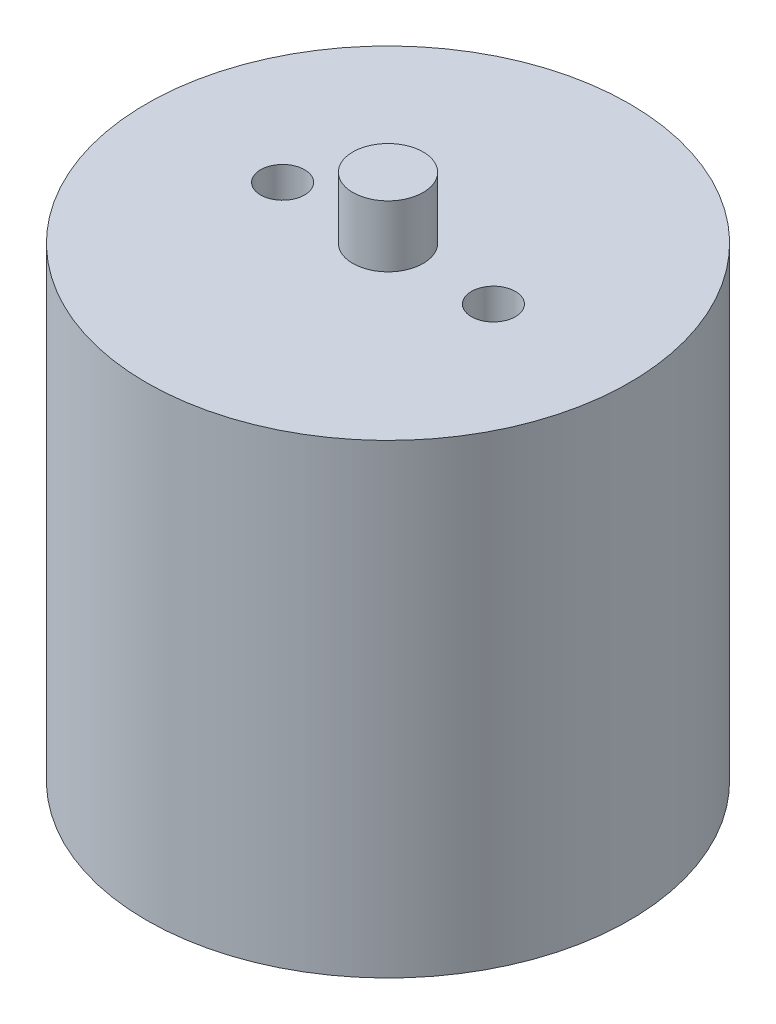
ISO-10303-21;
HEADER;
FILE_DESCRIPTION(('STEP AP214'),'2;1');
FILE_NAME('part.step','',(''),(''),'','','');
FILE_SCHEMA(('AUTOMOTIVE_DESIGN { 1 0 10303 214 1 1 1 1 }'));
ENDSEC;
DATA;
#1=APPLICATION_CONTEXT('core data for automotive mechanical design processes');
#2=APPLICATION_PROTOCOL_DEFINITION('international standard','automotive_design',2000,#1);
#3=PRODUCT_CONTEXT('',#1,'mechanical');
#4=PRODUCT('Part','Part','',(#3));
#5=PRODUCT_RELATED_PRODUCT_CATEGORY('part','',(#4));
#6=PRODUCT_DEFINITION_FORMATION('','',#4);
#7=PRODUCT_DEFINITION_CONTEXT('part definition',#1,'design');
#8=PRODUCT_DEFINITION('design','',#6,#7);
#9=PRODUCT_DEFINITION_SHAPE('','',#8);
#10=(LENGTH_UNIT() NAMED_UNIT(*) SI_UNIT(.MILLI.,.METRE.));
#11=(NAMED_UNIT(*) PLANE_ANGLE_UNIT() SI_UNIT($,.RADIAN.));
#12=(NAMED_UNIT(*) SI_UNIT($,.STERADIAN.) SOLID_ANGLE_UNIT());
#13=UNCERTAINTY_MEASURE_WITH_UNIT(LENGTH_MEASURE(1.E-05),#10,'distance_accuracy_value','');
#14=(GEOMETRIC_REPRESENTATION_CONTEXT(3) GLOBAL_UNCERTAINTY_ASSIGNED_CONTEXT((#13)) GLOBAL_UNIT_ASSIGNED_CONTEXT((#10,
#11,#12)) REPRESENTATION_CONTEXT('',''));
#15=CARTESIAN_POINT('',(0.,0.,0.));
#16=DIRECTION('',(0.,0.,1.));
#17=DIRECTION('',(1.,0.,0.));
#18=AXIS2_PLACEMENT_3D('',#15,#16,#17);
#19=CARTESIAN_POINT('',(0.,29.1,0.));
#20=DIRECTION('',(0.,-1.,0.));
#21=DIRECTION('',(0.,0.,-1.));
#22=AXIS2_PLACEMENT_3D('',#19,#20,#21);
#23=CYLINDRICAL_SURFACE('',#22,13.75);
#24=CARTESIAN_POINT('',(0.,29.1,0.));
#25=DIRECTION('',(0.,1.,0.));
#26=DIRECTION('',(0.,0.,1.));
#27=AXIS2_PLACEMENT_3D('',#24,#25,#26);
#28=CIRCLE('',#27,13.75);
#29=CARTESIAN_POINT('',(0.,29.1,13.75));
#30=VERTEX_POINT('',#29);
#31=EDGE_CURVE('E37',#30,#30,#28,.T.);
#32=ORIENTED_EDGE('',*,*,#31,.F.);
#33=EDGE_LOOP('',(#32));
#34=FACE_BOUND('',#33,.T.);
#35=CARTESIAN_POINT('',(0.,2.6,0.));
#36=DIRECTION('',(0.,1.,0.));
#37=DIRECTION('',(0.,0.,1.));
#38=AXIS2_PLACEMENT_3D('',#35,#36,#37);
#39=CIRCLE('',#38,13.75);
#40=CARTESIAN_POINT('',(0.,2.6,13.75));
#41=VERTEX_POINT('',#40);
#42=EDGE_CURVE('E41',#41,#41,#39,.T.);
#43=ORIENTED_EDGE('',*,*,#42,.T.);
#44=EDGE_LOOP('',(#43));
#45=FACE_BOUND('',#44,.T.);
#46=ADVANCED_FACE('F31',(#34,#45),#23,.T.);
#47=CARTESIAN_POINT('',(0.,29.1,0.));
#48=DIRECTION('',(0.,1.,0.));
#49=DIRECTION('',(0.,0.,1.));
#50=AXIS2_PLACEMENT_3D('',#47,#48,#49);
#51=PLANE('',#50);
#52=CARTESIAN_POINT('',(6.,29.1,0.));
#53=DIRECTION('',(0.,1.,0.));
#54=DIRECTION('',(0.,0.,1.));
#55=AXIS2_PLACEMENT_3D('',#52,#53,#54);
#56=CIRCLE('',#55,1.25);
#57=CARTESIAN_POINT('',(6.,29.1,1.25));
#58=VERTEX_POINT('',#57);
#59=EDGE_CURVE('E61',#58,#58,#56,.T.);
#60=ORIENTED_EDGE('',*,*,#59,.F.);
#61=EDGE_LOOP('',(#60));
#62=FACE_BOUND('',#61,.T.);
#63=CARTESIAN_POINT('',(-6.,29.1,0.));
#64=DIRECTION('',(0.,1.,0.));
#65=DIRECTION('',(0.,0.,1.));
#66=AXIS2_PLACEMENT_3D('',#63,#64,#65);
#67=CIRCLE('',#66,1.25);
#68=CARTESIAN_POINT('',(-6.,29.1,1.25));
#69=VERTEX_POINT('',#68);
#70=EDGE_CURVE('E57',#69,#69,#67,.T.);
#71=ORIENTED_EDGE('',*,*,#70,.F.);
#72=EDGE_LOOP('',(#71));
#73=FACE_BOUND('',#72,.T.);
#74=CARTESIAN_POINT('',(0.,29.1,0.));
#75=DIRECTION('',(0.,1.,0.));
#76=DIRECTION('',(0.,0.,1.));
#77=AXIS2_PLACEMENT_3D('',#74,#75,#76);
#78=CIRCLE('',#77,2.);
#79=CARTESIAN_POINT('',(0.,29.1,2.));
#80=VERTEX_POINT('',#79);
#81=EDGE_CURVE('E48',#80,#80,#78,.T.);
#82=ORIENTED_EDGE('',*,*,#81,.F.);
#83=EDGE_LOOP('',(#82));
#84=FACE_BOUND('',#83,.T.);
#85=ORIENTED_EDGE('',*,*,#31,.T.);
#86=EDGE_LOOP('',(#85));
#87=FACE_BOUND('',#86,.T.);
#88=ADVANCED_FACE('F106',(#62,#73,#84,#87),#51,.T.);
#89=CARTESIAN_POINT('',(0.,2.6,0.));
#90=DIRECTION('',(0.,1.,0.));
#91=DIRECTION('',(0.,0.,1.));
#92=AXIS2_PLACEMENT_3D('',#89,#90,#91);
#93=PLANE('',#92);
#94=CARTESIAN_POINT('',(0.,2.6,9.00000003399981));
#95=DIRECTION('',(0.,-1.,0.));
#96=DIRECTION('',(0.,0.,-1.));
#97=AXIS2_PLACEMENT_3D('',#94,#95,#96);
#98=CIRCLE('',#97,1.24999999999989);
#99=CARTESIAN_POINT('',(0.,2.6,7.75000003399992));
#100=VERTEX_POINT('',#99);
#101=EDGE_CURVE('E87',#100,#100,#98,.T.);
#102=ORIENTED_EDGE('',*,*,#101,.F.);
#103=EDGE_LOOP('',(#102));
#104=FACE_BOUND('',#103,.T.);
#105=CARTESIAN_POINT('',(0.,2.6,-9.00000003399981));
#106=DIRECTION('',(0.,-1.,0.));
#107=DIRECTION('',(0.,0.,-1.));
#108=AXIS2_PLACEMENT_3D('',#105,#106,#107);
#109=CIRCLE('',#108,1.24999999999989);
#110=CARTESIAN_POINT('',(0.,2.6,-10.2500000339997));
#111=VERTEX_POINT('',#110);
#112=EDGE_CURVE('E81',#111,#111,#109,.T.);
#113=ORIENTED_EDGE('',*,*,#112,.F.);
#114=EDGE_LOOP('',(#113));
#115=FACE_BOUND('',#114,.T.);
#116=CARTESIAN_POINT('',(-9.5000001,2.6,0.));
#117=DIRECTION('',(0.,-1.,0.));
#118=DIRECTION('',(0.,0.,-1.));
#119=AXIS2_PLACEMENT_3D('',#116,#117,#118);
#120=CIRCLE('',#119,1.25);
#121=CARTESIAN_POINT('',(-9.5000001,2.6,-1.25));
#122=VERTEX_POINT('',#121);
#123=EDGE_CURVE('E75',#122,#122,#120,.T.);
#124=ORIENTED_EDGE('',*,*,#123,.F.);
#125=EDGE_LOOP('',(#124));
#126=FACE_BOUND('',#125,.T.);
#127=CARTESIAN_POINT('',(9.5,2.6,0.));
#128=DIRECTION('',(0.,-1.,0.));
#129=DIRECTION('',(0.,0.,-1.));
#130=AXIS2_PLACEMENT_3D('',#127,#128,#129);
#131=CIRCLE('',#130,1.25);
#132=CARTESIAN_POINT('',(9.5,2.6,-1.25));
#133=VERTEX_POINT('',#132);
#134=EDGE_CURVE('E69',#133,#133,#131,.T.);
#135=ORIENTED_EDGE('',*,*,#134,.F.);
#136=EDGE_LOOP('',(#135));
#137=FACE_BOUND('',#136,.T.);
#138=CARTESIAN_POINT('',(0.,2.6,0.));
#139=DIRECTION('',(0.,1.,0.));
#140=DIRECTION('',(0.,0.,1.));
#141=AXIS2_PLACEMENT_3D('',#138,#139,#140);
#142=CIRCLE('',#141,2.);
#143=CARTESIAN_POINT('',(0.,2.6,2.));
#144=VERTEX_POINT('',#143);
#145=EDGE_CURVE('E10',#144,#144,#142,.F.);
#146=ORIENTED_EDGE('',*,*,#145,.F.);
#147=EDGE_LOOP('',(#146));
#148=FACE_BOUND('',#147,.T.);
#149=ORIENTED_EDGE('',*,*,#42,.F.);
#150=EDGE_LOOP('',(#149));
#151=FACE_BOUND('',#150,.T.);
#152=ADVANCED_FACE('F102',(#104,#115,#126,#137,#148,#151),#93,.F.);
#153=CARTESIAN_POINT('',(0.,32.6,0.));
#154=DIRECTION('',(0.,-1.,0.));
#155=DIRECTION('',(0.,0.,-1.));
#156=AXIS2_PLACEMENT_3D('',#153,#154,#155);
#157=CYLINDRICAL_SURFACE('',#156,2.);
#158=CARTESIAN_POINT('',(0.,32.6,0.));
#159=DIRECTION('',(0.,1.,0.));
#160=DIRECTION('',(0.,0.,1.));
#161=AXIS2_PLACEMENT_3D('',#158,#159,#160);
#162=CIRCLE('',#161,2.);
#163=CARTESIAN_POINT('',(0.,32.6,2.));
#164=VERTEX_POINT('',#163);
#165=EDGE_CURVE('E46',#164,#164,#162,.T.);
#166=ORIENTED_EDGE('',*,*,#165,.F.);
#167=EDGE_LOOP('',(#166));
#168=FACE_BOUND('',#167,.T.);
#169=ORIENTED_EDGE('',*,*,#81,.T.);
#170=EDGE_LOOP('',(#169));
#171=FACE_BOUND('',#170,.T.);
#172=ADVANCED_FACE('F105',(#168,#171),#157,.T.);
#173=CARTESIAN_POINT('',(0.,32.6,0.));
#174=DIRECTION('',(0.,1.,0.));
#175=DIRECTION('',(0.,0.,1.));
#176=AXIS2_PLACEMENT_3D('',#173,#174,#175);
#177=PLANE('',#176);
#178=ORIENTED_EDGE('',*,*,#165,.T.);
#179=EDGE_LOOP('',(#178));
#180=FACE_BOUND('',#179,.T.);
#181=ADVANCED_FACE('F130',(#180),#177,.T.);
#182=CARTESIAN_POINT('',(-6.,24.1,0.));
#183=DIRECTION('',(0.,1.,0.));
#184=DIRECTION('',(0.,0.,1.));
#185=AXIS2_PLACEMENT_3D('',#182,#183,#184);
#186=CYLINDRICAL_SURFACE('',#185,1.25);
#187=CARTESIAN_POINT('',(-6.,24.1,0.));
#188=DIRECTION('',(0.,1.,0.));
#189=DIRECTION('',(0.,0.,1.));
#190=AXIS2_PLACEMENT_3D('',#187,#188,#189);
#191=CIRCLE('',#190,1.25);
#192=CARTESIAN_POINT('',(-6.,24.1,1.25));
#193=VERTEX_POINT('',#192);
#194=EDGE_CURVE('E54',#193,#193,#191,.T.);
#195=ORIENTED_EDGE('',*,*,#194,.F.);
#196=EDGE_LOOP('',(#195));
#197=FACE_BOUND('',#196,.T.);
#198=ORIENTED_EDGE('',*,*,#70,.T.);
#199=EDGE_LOOP('',(#198));
#200=FACE_BOUND('',#199,.T.);
#201=ADVANCED_FACE('F134',(#197,#200),#186,.F.);
#202=CARTESIAN_POINT('',(-6.,24.1,0.));
#203=DIRECTION('',(0.,1.,0.));
#204=DIRECTION('',(0.,0.,1.));
#205=AXIS2_PLACEMENT_3D('',#202,#203,#204);
#206=PLANE('',#205);
#207=ORIENTED_EDGE('',*,*,#194,.T.);
#208=EDGE_LOOP('',(#207));
#209=FACE_BOUND('',#208,.T.);
#210=ADVANCED_FACE('F136',(#209),#206,.T.);
#211=CARTESIAN_POINT('',(6.,24.1,0.));
#212=DIRECTION('',(0.,1.,0.));
#213=DIRECTION('',(0.,0.,1.));
#214=AXIS2_PLACEMENT_3D('',#211,#212,#213);
#215=CYLINDRICAL_SURFACE('',#214,1.25);
#216=CARTESIAN_POINT('',(6.,24.1,0.));
#217=DIRECTION('',(0.,1.,0.));
#218=DIRECTION('',(0.,0.,1.));
#219=AXIS2_PLACEMENT_3D('',#216,#217,#218);
#220=CIRCLE('',#219,1.25);
#221=CARTESIAN_POINT('',(6.,24.1,1.25));
#222=VERTEX_POINT('',#221);
#223=EDGE_CURVE('E51',#222,#222,#220,.T.);
#224=ORIENTED_EDGE('',*,*,#223,.F.);
#225=EDGE_LOOP('',(#224));
#226=FACE_BOUND('',#225,.T.);
#227=ORIENTED_EDGE('',*,*,#59,.T.);
#228=EDGE_LOOP('',(#227));
#229=FACE_BOUND('',#228,.T.);
#230=ADVANCED_FACE('F139',(#226,#229),#215,.F.);
#231=CARTESIAN_POINT('',(6.,24.1,0.));
#232=DIRECTION('',(0.,1.,0.));
#233=DIRECTION('',(0.,0.,1.));
#234=AXIS2_PLACEMENT_3D('',#231,#232,#233);
#235=PLANE('',#234);
#236=ORIENTED_EDGE('',*,*,#223,.T.);
#237=EDGE_LOOP('',(#236));
#238=FACE_BOUND('',#237,.T.);
#239=ADVANCED_FACE('F146',(#238),#235,.T.);
#240=CARTESIAN_POINT('',(0.,0.,0.));
#241=DIRECTION('',(0.,1.,0.));
#242=DIRECTION('',(0.,0.,1.));
#243=AXIS2_PLACEMENT_3D('',#240,#241,#242);
#244=PLANE('',#243);
#245=CARTESIAN_POINT('',(0.,0.,0.));
#246=DIRECTION('',(0.,1.,0.));
#247=DIRECTION('',(0.,0.,1.));
#248=AXIS2_PLACEMENT_3D('',#245,#246,#247);
#249=CIRCLE('',#248,2.);
#250=CARTESIAN_POINT('',(0.,0.,2.));
#251=VERTEX_POINT('',#250);
#252=EDGE_CURVE('E58',#251,#251,#249,.T.);
#253=ORIENTED_EDGE('',*,*,#252,.F.);
#254=EDGE_LOOP('',(#253));
#255=FACE_BOUND('',#254,.T.);
#256=ADVANCED_FACE('F150',(#255),#244,.F.);
#257=CARTESIAN_POINT('',(0.,32.602,0.));
#258=DIRECTION('',(0.,-1.,0.));
#259=DIRECTION('',(0.,0.,-1.));
#260=AXIS2_PLACEMENT_3D('',#257,#258,#259);
#261=CYLINDRICAL_SURFACE('',#260,2.);
#262=ORIENTED_EDGE('',*,*,#252,.T.);
#263=EDGE_LOOP('',(#262));
#264=FACE_BOUND('',#263,.T.);
#265=ORIENTED_EDGE('',*,*,#145,.T.);
#266=EDGE_LOOP('',(#265));
#267=FACE_BOUND('',#266,.T.);
#268=ADVANCED_FACE('F152',(#264,#267),#261,.T.);
#269=CARTESIAN_POINT('',(9.5,7.6,0.));
#270=DIRECTION('',(0.,-1.,0.));
#271=DIRECTION('',(0.,0.,-1.));
#272=AXIS2_PLACEMENT_3D('',#269,#270,#271);
#273=CYLINDRICAL_SURFACE('',#272,1.25);
#274=CARTESIAN_POINT('',(9.5,7.6,0.));
#275=DIRECTION('',(0.,-1.,0.));
#276=DIRECTION('',(0.,0.,-1.));
#277=AXIS2_PLACEMENT_3D('',#274,#275,#276);
#278=CIRCLE('',#277,1.25);
#279=CARTESIAN_POINT('',(9.5,7.6,-1.25));
#280=VERTEX_POINT('',#279);
#281=EDGE_CURVE('E72',#280,#280,#278,.T.);
#282=ORIENTED_EDGE('',*,*,#281,.F.);
#283=EDGE_LOOP('',(#282));
#284=FACE_BOUND('',#283,.T.);
#285=ORIENTED_EDGE('',*,*,#134,.T.);
#286=EDGE_LOOP('',(#285));
#287=FACE_BOUND('',#286,.T.);
#288=ADVANCED_FACE('F155',(#284,#287),#273,.F.);
#289=CARTESIAN_POINT('',(9.5,7.6,0.));
#290=DIRECTION('',(0.,-1.,0.));
#291=DIRECTION('',(0.,0.,-1.));
#292=AXIS2_PLACEMENT_3D('',#289,#290,#291);
#293=PLANE('',#292);
#294=ORIENTED_EDGE('',*,*,#281,.T.);
#295=EDGE_LOOP('',(#294));
#296=FACE_BOUND('',#295,.T.);
#297=ADVANCED_FACE('F162',(#296),#293,.T.);
#298=CARTESIAN_POINT('',(-9.5000001,7.6,0.));
#299=DIRECTION('',(0.,-1.,0.));
#300=DIRECTION('',(0.,0.,-1.));
#301=AXIS2_PLACEMENT_3D('',#298,#299,#300);
#302=CYLINDRICAL_SURFACE('',#301,1.25);
#303=CARTESIAN_POINT('',(-9.5000001,7.6,0.));
#304=DIRECTION('',(0.,-1.,0.));
#305=DIRECTION('',(0.,0.,-1.));
#306=AXIS2_PLACEMENT_3D('',#303,#304,#305);
#307=CIRCLE('',#306,1.25);
#308=CARTESIAN_POINT('',(-9.5000001,7.6,-1.25));
#309=VERTEX_POINT('',#308);
#310=EDGE_CURVE('E78',#309,#309,#307,.T.);
#311=ORIENTED_EDGE('',*,*,#310,.F.);
#312=EDGE_LOOP('',(#311));
#313=FACE_BOUND('',#312,.T.);
#314=ORIENTED_EDGE('',*,*,#123,.T.);
#315=EDGE_LOOP('',(#314));
#316=FACE_BOUND('',#315,.T.);
#317=ADVANCED_FACE('F166',(#313,#316),#302,.F.);
#318=CARTESIAN_POINT('',(-9.5000001,7.6,0.));
#319=DIRECTION('',(0.,-1.,0.));
#320=DIRECTION('',(0.,0.,-1.));
#321=AXIS2_PLACEMENT_3D('',#318,#319,#320);
#322=PLANE('',#321);
#323=ORIENTED_EDGE('',*,*,#310,.T.);
#324=EDGE_LOOP('',(#323));
#325=FACE_BOUND('',#324,.T.);
#326=ADVANCED_FACE('F170',(#325),#322,.T.);
#327=CARTESIAN_POINT('',(0.,7.6,-9.00000003399981));
#328=DIRECTION('',(0.,-1.,0.));
#329=DIRECTION('',(0.,0.,-1.));
#330=AXIS2_PLACEMENT_3D('',#327,#328,#329);
#331=CYLINDRICAL_SURFACE('',#330,1.24999999999989);
#332=CARTESIAN_POINT('',(0.,7.6,-9.00000003399981));
#333=DIRECTION('',(0.,-1.,0.));
#334=DIRECTION('',(0.,0.,-1.));
#335=AXIS2_PLACEMENT_3D('',#332,#333,#334);
#336=CIRCLE('',#335,1.24999999999989);
#337=CARTESIAN_POINT('',(0.,7.6,-10.2500000339997));
#338=VERTEX_POINT('',#337);
#339=EDGE_CURVE('E84',#338,#338,#336,.T.);
#340=ORIENTED_EDGE('',*,*,#339,.F.);
#341=EDGE_LOOP('',(#340));
#342=FACE_BOUND('',#341,.T.);
#343=ORIENTED_EDGE('',*,*,#112,.T.);
#344=EDGE_LOOP('',(#343));
#345=FACE_BOUND('',#344,.T.);
#346=ADVANCED_FACE('F174',(#342,#345),#331,.F.);
#347=CARTESIAN_POINT('',(0.,7.6,-9.00000003399981));
#348=DIRECTION('',(0.,-1.,0.));
#349=DIRECTION('',(0.,0.,-1.));
#350=AXIS2_PLACEMENT_3D('',#347,#348,#349);
#351=PLANE('',#350);
#352=ORIENTED_EDGE('',*,*,#339,.T.);
#353=EDGE_LOOP('',(#352));
#354=FACE_BOUND('',#353,.T.);
#355=ADVANCED_FACE('F98',(#354),#351,.T.);
#356=CARTESIAN_POINT('',(0.,7.6,9.00000003399981));
#357=DIRECTION('',(0.,-1.,0.));
#358=DIRECTION('',(0.,0.,-1.));
#359=AXIS2_PLACEMENT_3D('',#356,#357,#358);
#360=CYLINDRICAL_SURFACE('',#359,1.24999999999989);
#361=CARTESIAN_POINT('',(0.,7.6,9.00000003399981));
#362=DIRECTION('',(0.,-1.,0.));
#363=DIRECTION('',(0.,0.,-1.));
#364=AXIS2_PLACEMENT_3D('',#361,#362,#363);
#365=CIRCLE('',#364,1.24999999999989);
#366=CARTESIAN_POINT('',(0.,7.6,7.75000003399992));
#367=VERTEX_POINT('',#366);
#368=EDGE_CURVE('E68',#367,#367,#365,.T.);
#369=ORIENTED_EDGE('',*,*,#368,.F.);
#370=EDGE_LOOP('',(#369));
#371=FACE_BOUND('',#370,.T.);
#372=ORIENTED_EDGE('',*,*,#101,.T.);
#373=EDGE_LOOP('',(#372));
#374=FACE_BOUND('',#373,.T.);
#375=ADVANCED_FACE('F95',(#371,#374),#360,.F.);
#376=CARTESIAN_POINT('',(0.,7.6,9.00000003399981));
#377=DIRECTION('',(0.,-1.,0.));
#378=DIRECTION('',(0.,0.,-1.));
#379=AXIS2_PLACEMENT_3D('',#376,#377,#378);
#380=PLANE('',#379);
#381=ORIENTED_EDGE('',*,*,#368,.T.);
#382=EDGE_LOOP('',(#381));
#383=FACE_BOUND('',#382,.T.);
#384=ADVANCED_FACE('F93',(#383),#380,.T.);
#385=CLOSED_SHELL('',(#46,#88,#152,#172,#181,#201,#210,#230,#239,#256,#268,#288,#297,#317,#326,
#346,#355,#375,#384));
#386=MANIFOLD_SOLID_BREP('B2',#385);
#387=ADVANCED_BREP_SHAPE_REPRESENTATION('',(#18,#386),#14);
#388=SHAPE_DEFINITION_REPRESENTATION(#9,#387);
ENDSEC;
END-ISO-10303-21;
